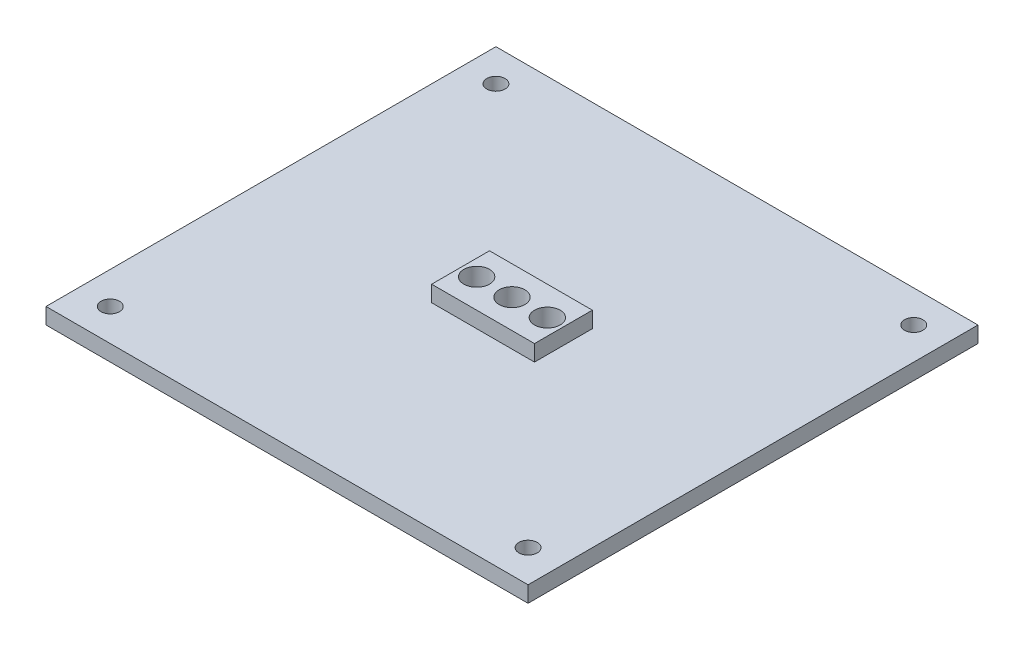
ISO-10303-21;
HEADER;
FILE_DESCRIPTION(('STEP AP214'),'2;1');
FILE_NAME('part.step','',(''),(''),'','','');
FILE_SCHEMA(('AUTOMOTIVE_DESIGN { 1 0 10303 214 1 1 1 1 }'));
ENDSEC;
DATA;
#1=APPLICATION_CONTEXT('core data for automotive mechanical design processes');
#2=APPLICATION_PROTOCOL_DEFINITION('international standard','automotive_design',2000,#1);
#3=PRODUCT_CONTEXT('',#1,'mechanical');
#4=PRODUCT('Part','Part','',(#3));
#5=PRODUCT_RELATED_PRODUCT_CATEGORY('part','',(#4));
#6=PRODUCT_DEFINITION_FORMATION('','',#4);
#7=PRODUCT_DEFINITION_CONTEXT('part definition',#1,'design');
#8=PRODUCT_DEFINITION('design','',#6,#7);
#9=PRODUCT_DEFINITION_SHAPE('','',#8);
#10=(LENGTH_UNIT() NAMED_UNIT(*) SI_UNIT(.MILLI.,.METRE.));
#11=(NAMED_UNIT(*) PLANE_ANGLE_UNIT() SI_UNIT($,.RADIAN.));
#12=(NAMED_UNIT(*) SI_UNIT($,.STERADIAN.) SOLID_ANGLE_UNIT());
#13=UNCERTAINTY_MEASURE_WITH_UNIT(LENGTH_MEASURE(1.E-05),#10,'distance_accuracy_value','');
#14=(GEOMETRIC_REPRESENTATION_CONTEXT(3) GLOBAL_UNCERTAINTY_ASSIGNED_CONTEXT((#13)) GLOBAL_UNIT_ASSIGNED_CONTEXT((#10,
#11,#12)) REPRESENTATION_CONTEXT('',''));
#15=CARTESIAN_POINT('',(0.,0.,0.));
#16=DIRECTION('',(0.,0.,1.));
#17=DIRECTION('',(1.,0.,0.));
#18=AXIS2_PLACEMENT_3D('',#15,#16,#17);
#19=CARTESIAN_POINT('',(0.,5.,0.));
#20=DIRECTION('',(0.,-1.,0.));
#21=DIRECTION('',(0.,0.,-1.));
#22=AXIS2_PLACEMENT_3D('',#19,#20,#21);
#23=PLANE('',#22);
#24=CARTESIAN_POINT('',(-65.5459975016604,5.,11.5427570870634));
#25=DIRECTION('',(0.,1.,0.));
#26=DIRECTION('',(0.,0.,1.));
#27=AXIS2_PLACEMENT_3D('',#24,#25,#26);
#28=CIRCLE('',#27,2.85);
#29=CARTESIAN_POINT('',(-65.5459975016604,5.,14.3927570870634));
#30=VERTEX_POINT('',#29);
#31=EDGE_CURVE('E248',#30,#30,#28,.T.);
#32=ORIENTED_EDGE('',*,*,#31,.F.);
#33=EDGE_LOOP('',(#32));
#34=FACE_BOUND('',#33,.T.);
#35=CARTESIAN_POINT('',(64.4540024983396,5.,11.5427570870634));
#36=DIRECTION('',(0.,1.,0.));
#37=DIRECTION('',(0.,0.,1.));
#38=AXIS2_PLACEMENT_3D('',#35,#36,#37);
#39=CIRCLE('',#38,2.85);
#40=CARTESIAN_POINT('',(64.4540024983396,5.,14.3927570870634));
#41=VERTEX_POINT('',#40);
#42=EDGE_CURVE('E254',#41,#41,#39,.T.);
#43=ORIENTED_EDGE('',*,*,#42,.F.);
#44=EDGE_LOOP('',(#43));
#45=FACE_BOUND('',#44,.T.);
#46=CARTESIAN_POINT('',(64.4540024983396,5.,-108.457242912937));
#47=DIRECTION('',(0.,1.,0.));
#48=DIRECTION('',(0.,0.,1.));
#49=AXIS2_PLACEMENT_3D('',#46,#47,#48);
#50=CIRCLE('',#49,2.85);
#51=CARTESIAN_POINT('',(64.4540024983396,5.,-105.607242912937));
#52=VERTEX_POINT('',#51);
#53=EDGE_CURVE('E260',#52,#52,#50,.T.);
#54=ORIENTED_EDGE('',*,*,#53,.F.);
#55=EDGE_LOOP('',(#54));
#56=FACE_BOUND('',#55,.T.);
#57=CARTESIAN_POINT('',(-65.5459975016604,5.,-108.457242912937));
#58=DIRECTION('',(0.,1.,0.));
#59=DIRECTION('',(0.,0.,1.));
#60=AXIS2_PLACEMENT_3D('',#57,#58,#59);
#61=CIRCLE('',#60,2.85);
#62=CARTESIAN_POINT('',(-65.5459975016604,5.,-105.607242912937));
#63=VERTEX_POINT('',#62);
#64=EDGE_CURVE('E269',#63,#63,#61,.T.);
#65=ORIENTED_EDGE('',*,*,#64,.F.);
#66=EDGE_LOOP('',(#65));
#67=FACE_BOUND('',#66,.T.);
#68=DIRECTION('',(-1.,0.,0.));
#69=VECTOR('',#68,1.);
#70=CARTESIAN_POINT('',(-75.5459975016604,5.,-118.457242912937));
#71=LINE('',#70,#69);
#72=CARTESIAN_POINT('',(74.4540024983396,5.,-118.457242912937));
#73=VERTEX_POINT('',#72);
#74=CARTESIAN_POINT('',(-75.5459975016604,5.,-118.457242912937));
#75=VERTEX_POINT('',#74);
#76=EDGE_CURVE('E275',#73,#75,#71,.T.);
#77=ORIENTED_EDGE('',*,*,#76,.T.);
#78=DIRECTION('',(0.,0.,1.));
#79=VECTOR('',#78,1.);
#80=CARTESIAN_POINT('',(-75.5459975016604,5.,-118.457242912937));
#81=LINE('',#80,#79);
#82=CARTESIAN_POINT('',(-75.5459975016604,5.,21.5427570870634));
#83=VERTEX_POINT('',#82);
#84=EDGE_CURVE('E278',#75,#83,#81,.T.);
#85=ORIENTED_EDGE('',*,*,#84,.T.);
#86=DIRECTION('',(1.,0.,0.));
#87=VECTOR('',#86,1.);
#88=CARTESIAN_POINT('',(-75.5459975016604,5.,21.5427570870634));
#89=LINE('',#88,#87);
#90=CARTESIAN_POINT('',(74.4540024983396,5.,21.5427570870634));
#91=VERTEX_POINT('',#90);
#92=EDGE_CURVE('E281',#83,#91,#89,.T.);
#93=ORIENTED_EDGE('',*,*,#92,.T.);
#94=DIRECTION('',(0.,0.,-1.));
#95=VECTOR('',#94,1.);
#96=CARTESIAN_POINT('',(74.4540024983396,5.,-118.457242912937));
#97=LINE('',#96,#95);
#98=EDGE_CURVE('E283',#91,#73,#97,.T.);
#99=ORIENTED_EDGE('',*,*,#98,.T.);
#100=EDGE_LOOP('',(#77,#85,#93,#99));
#101=FACE_BOUND('',#100,.T.);
#102=DIRECTION('',(0.,0.,-1.));
#103=VECTOR('',#102,1.);
#104=CARTESIAN_POINT('',(15.4540024983396,5.,0.));
#105=LINE('',#104,#103);
#106=CARTESIAN_POINT('',(15.4540024983396,5.,-39.4572429129366));
#107=VERTEX_POINT('',#106);
#108=CARTESIAN_POINT('',(15.4540024983396,5.,-57.4572429129366));
#109=VERTEX_POINT('',#108);
#110=EDGE_CURVE('E165',#107,#109,#105,.T.);
#111=ORIENTED_EDGE('',*,*,#110,.F.);
#112=DIRECTION('',(1.,0.,0.));
#113=VECTOR('',#112,1.);
#114=CARTESIAN_POINT('',(0.,5.,-39.4572429129366));
#115=LINE('',#114,#113);
#116=CARTESIAN_POINT('',(-16.5459975016604,5.,-39.4572429129366));
#117=VERTEX_POINT('',#116);
#118=EDGE_CURVE('E169',#117,#107,#115,.T.);
#119=ORIENTED_EDGE('',*,*,#118,.F.);
#120=DIRECTION('',(0.,0.,1.));
#121=VECTOR('',#120,1.);
#122=CARTESIAN_POINT('',(-16.5459975016604,5.,0.));
#123=LINE('',#122,#121);
#124=CARTESIAN_POINT('',(-16.5459975016604,5.,-57.4572429129367));
#125=VERTEX_POINT('',#124);
#126=EDGE_CURVE('E382',#125,#117,#123,.T.);
#127=ORIENTED_EDGE('',*,*,#126,.F.);
#128=DIRECTION('',(-1.,0.,0.));
#129=VECTOR('',#128,1.);
#130=CARTESIAN_POINT('',(1.24590535182466E-13,5.,-57.4572429129366));
#131=LINE('',#130,#129);
#132=EDGE_CURVE('E380',#109,#125,#131,.T.);
#133=ORIENTED_EDGE('',*,*,#132,.F.);
#134=EDGE_LOOP('',(#111,#119,#127,#133));
#135=FACE_BOUND('',#134,.T.);
#136=ADVANCED_FACE('F150',(#34,#45,#56,#67,#101,#135),#23,.F.);
#137=CARTESIAN_POINT('',(0.,0.,0.));
#138=DIRECTION('',(0.,-1.,0.));
#139=DIRECTION('',(0.,0.,-1.));
#140=AXIS2_PLACEMENT_3D('',#137,#138,#139);
#141=PLANE('',#140);
#142=CARTESIAN_POINT('',(10.4540024983396,0.,-48.4572429129366));
#143=DIRECTION('',(0.,1.,0.));
#144=DIRECTION('',(0.,0.,1.));
#145=AXIS2_PLACEMENT_3D('',#142,#143,#144);
#146=CIRCLE('',#145,4.);
#147=CARTESIAN_POINT('',(10.4540024983396,0.,-44.4572429129366));
#148=VERTEX_POINT('',#147);
#149=EDGE_CURVE('E239',#148,#148,#146,.T.);
#150=ORIENTED_EDGE('',*,*,#149,.T.);
#151=EDGE_LOOP('',(#150));
#152=FACE_BOUND('',#151,.T.);
#153=CARTESIAN_POINT('',(64.4540024983396,0.,11.5427570870634));
#154=DIRECTION('',(0.,1.,0.));
#155=DIRECTION('',(0.,0.,1.));
#156=AXIS2_PLACEMENT_3D('',#153,#154,#155);
#157=CIRCLE('',#156,2.85);
#158=CARTESIAN_POINT('',(64.4540024983396,0.,14.3927570870634));
#159=VERTEX_POINT('',#158);
#160=EDGE_CURVE('E251',#159,#159,#157,.T.);
#161=ORIENTED_EDGE('',*,*,#160,.T.);
#162=EDGE_LOOP('',(#161));
#163=FACE_BOUND('',#162,.T.);
#164=CARTESIAN_POINT('',(-0.545997501660393,0.,-48.4572429129366));
#165=DIRECTION('',(0.,1.,0.));
#166=DIRECTION('',(0.,0.,1.));
#167=AXIS2_PLACEMENT_3D('',#164,#165,#166);
#168=CIRCLE('',#167,4.);
#169=CARTESIAN_POINT('',(-0.545997501660393,0.,-44.4572429129366));
#170=VERTEX_POINT('',#169);
#171=EDGE_CURVE('E263',#170,#170,#168,.T.);
#172=ORIENTED_EDGE('',*,*,#171,.T.);
#173=EDGE_LOOP('',(#172));
#174=FACE_BOUND('',#173,.T.);
#175=DIRECTION('',(-1.,0.,0.));
#176=VECTOR('',#175,1.);
#177=CARTESIAN_POINT('',(-75.5459975016604,0.,-118.457242912937));
#178=LINE('',#177,#176);
#179=CARTESIAN_POINT('',(74.4540024983396,0.,-118.457242912937));
#180=VERTEX_POINT('',#179);
#181=CARTESIAN_POINT('',(-75.5459975016604,0.,-118.457242912937));
#182=VERTEX_POINT('',#181);
#183=EDGE_CURVE('E272',#180,#182,#178,.T.);
#184=ORIENTED_EDGE('',*,*,#183,.F.);
#185=DIRECTION('',(0.,0.,-1.));
#186=VECTOR('',#185,1.);
#187=CARTESIAN_POINT('',(74.4540024983396,0.,-118.457242912937));
#188=LINE('',#187,#186);
#189=CARTESIAN_POINT('',(74.4540024983396,0.,21.5427570870634));
#190=VERTEX_POINT('',#189);
#191=EDGE_CURVE('E279',#190,#180,#188,.T.);
#192=ORIENTED_EDGE('',*,*,#191,.F.);
#193=DIRECTION('',(1.,0.,0.));
#194=VECTOR('',#193,1.);
#195=CARTESIAN_POINT('',(-75.5459975016604,0.,21.5427570870634));
#196=LINE('',#195,#194);
#197=CARTESIAN_POINT('',(-75.5459975016604,0.,21.5427570870634));
#198=VERTEX_POINT('',#197);
#199=EDGE_CURVE('E290',#198,#190,#196,.T.);
#200=ORIENTED_EDGE('',*,*,#199,.F.);
#201=DIRECTION('',(0.,0.,1.));
#202=VECTOR('',#201,1.);
#203=CARTESIAN_POINT('',(-75.5459975016604,0.,-118.457242912937));
#204=LINE('',#203,#202);
#205=EDGE_CURVE('E288',#182,#198,#204,.T.);
#206=ORIENTED_EDGE('',*,*,#205,.F.);
#207=EDGE_LOOP('',(#184,#192,#200,#206));
#208=FACE_BOUND('',#207,.T.);
#209=CARTESIAN_POINT('',(-65.5459975016604,0.,-108.457242912937));
#210=DIRECTION('',(0.,1.,0.));
#211=DIRECTION('',(0.,0.,1.));
#212=AXIS2_PLACEMENT_3D('',#209,#210,#211);
#213=CIRCLE('',#212,2.85);
#214=CARTESIAN_POINT('',(-65.5459975016604,0.,-105.607242912937));
#215=VERTEX_POINT('',#214);
#216=EDGE_CURVE('E268',#215,#215,#213,.T.);
#217=ORIENTED_EDGE('',*,*,#216,.T.);
#218=EDGE_LOOP('',(#217));
#219=FACE_BOUND('',#218,.T.);
#220=CARTESIAN_POINT('',(64.4540024983396,0.,-108.457242912937));
#221=DIRECTION('',(0.,1.,0.));
#222=DIRECTION('',(0.,0.,1.));
#223=AXIS2_PLACEMENT_3D('',#220,#221,#222);
#224=CIRCLE('',#223,2.85);
#225=CARTESIAN_POINT('',(64.4540024983396,0.,-105.607242912937));
#226=VERTEX_POINT('',#225);
#227=EDGE_CURVE('E257',#226,#226,#224,.T.);
#228=ORIENTED_EDGE('',*,*,#227,.T.);
#229=EDGE_LOOP('',(#228));
#230=FACE_BOUND('',#229,.T.);
#231=CARTESIAN_POINT('',(-65.5459975016604,0.,11.5427570870634));
#232=DIRECTION('',(0.,1.,0.));
#233=DIRECTION('',(0.,0.,1.));
#234=AXIS2_PLACEMENT_3D('',#231,#232,#233);
#235=CIRCLE('',#234,2.85);
#236=CARTESIAN_POINT('',(-65.5459975016604,0.,14.3927570870634));
#237=VERTEX_POINT('',#236);
#238=EDGE_CURVE('E247',#237,#237,#235,.T.);
#239=ORIENTED_EDGE('',*,*,#238,.T.);
#240=EDGE_LOOP('',(#239));
#241=FACE_BOUND('',#240,.T.);
#242=CARTESIAN_POINT('',(-11.5459975016604,0.,-48.4572429129366));
#243=DIRECTION('',(0.,1.,0.));
#244=DIRECTION('',(0.,0.,1.));
#245=AXIS2_PLACEMENT_3D('',#242,#243,#244);
#246=CIRCLE('',#245,4.);
#247=CARTESIAN_POINT('',(-11.5459975016604,0.,-44.4572429129366));
#248=VERTEX_POINT('',#247);
#249=EDGE_CURVE('E236',#248,#248,#246,.T.);
#250=ORIENTED_EDGE('',*,*,#249,.T.);
#251=EDGE_LOOP('',(#250));
#252=FACE_BOUND('',#251,.T.);
#253=ADVANCED_FACE('F308',(#152,#163,#174,#208,#219,#230,#241,#252),#141,.T.);
#254=CARTESIAN_POINT('',(-75.5459975016604,5.,-118.457242912937));
#255=DIRECTION('',(0.,0.,1.));
#256=DIRECTION('',(1.,0.,0.));
#257=AXIS2_PLACEMENT_3D('',#254,#255,#256);
#258=PLANE('',#257);
#259=ORIENTED_EDGE('',*,*,#183,.T.);
#260=DIRECTION('',(0.,-1.,0.));
#261=VECTOR('',#260,1.);
#262=CARTESIAN_POINT('',(-75.5459975016604,5.,-118.457242912937));
#263=LINE('',#262,#261);
#264=EDGE_CURVE('E12',#75,#182,#263,.T.);
#265=ORIENTED_EDGE('',*,*,#264,.F.);
#266=ORIENTED_EDGE('',*,*,#76,.F.);
#267=DIRECTION('',(0.,-1.,0.));
#268=VECTOR('',#267,1.);
#269=CARTESIAN_POINT('',(74.4540024983396,5.,-118.457242912937));
#270=LINE('',#269,#268);
#271=EDGE_CURVE('E285',#73,#180,#270,.T.);
#272=ORIENTED_EDGE('',*,*,#271,.T.);
#273=EDGE_LOOP('',(#259,#265,#266,#272));
#274=FACE_BOUND('',#273,.T.);
#275=ADVANCED_FACE('F152',(#274),#258,.F.);
#276=CARTESIAN_POINT('',(-75.5459975016604,5.,-118.457242912937));
#277=DIRECTION('',(1.,0.,0.));
#278=DIRECTION('',(0.,0.,-1.));
#279=AXIS2_PLACEMENT_3D('',#276,#277,#278);
#280=PLANE('',#279);
#281=ORIENTED_EDGE('',*,*,#205,.T.);
#282=DIRECTION('',(0.,-1.,0.));
#283=VECTOR('',#282,1.);
#284=CARTESIAN_POINT('',(-75.5459975016604,5.,21.5427570870634));
#285=LINE('',#284,#283);
#286=EDGE_CURVE('E158',#83,#198,#285,.T.);
#287=ORIENTED_EDGE('',*,*,#286,.F.);
#288=ORIENTED_EDGE('',*,*,#84,.F.);
#289=ORIENTED_EDGE('',*,*,#264,.T.);
#290=EDGE_LOOP('',(#281,#287,#288,#289));
#291=FACE_BOUND('',#290,.T.);
#292=ADVANCED_FACE('F318',(#291),#280,.F.);
#293=CARTESIAN_POINT('',(-75.5459975016604,5.,21.5427570870634));
#294=DIRECTION('',(0.,0.,-1.));
#295=DIRECTION('',(-1.,0.,0.));
#296=AXIS2_PLACEMENT_3D('',#293,#294,#295);
#297=PLANE('',#296);
#298=ORIENTED_EDGE('',*,*,#199,.T.);
#299=DIRECTION('',(0.,-1.,0.));
#300=VECTOR('',#299,1.);
#301=CARTESIAN_POINT('',(74.4540024983396,5.,21.5427570870634));
#302=LINE('',#301,#300);
#303=EDGE_CURVE('E295',#91,#190,#302,.T.);
#304=ORIENTED_EDGE('',*,*,#303,.F.);
#305=ORIENTED_EDGE('',*,*,#92,.F.);
#306=ORIENTED_EDGE('',*,*,#286,.T.);
#307=EDGE_LOOP('',(#298,#304,#305,#306));
#308=FACE_BOUND('',#307,.T.);
#309=ADVANCED_FACE('F302',(#308),#297,.F.);
#310=CARTESIAN_POINT('',(74.4540024983396,5.,-118.457242912937));
#311=DIRECTION('',(-1.,0.,0.));
#312=DIRECTION('',(0.,0.,1.));
#313=AXIS2_PLACEMENT_3D('',#310,#311,#312);
#314=PLANE('',#313);
#315=ORIENTED_EDGE('',*,*,#191,.T.);
#316=ORIENTED_EDGE('',*,*,#271,.F.);
#317=ORIENTED_EDGE('',*,*,#98,.F.);
#318=ORIENTED_EDGE('',*,*,#303,.T.);
#319=EDGE_LOOP('',(#315,#316,#317,#318));
#320=FACE_BOUND('',#319,.T.);
#321=ADVANCED_FACE('F312',(#320),#314,.F.);
#322=CARTESIAN_POINT('',(-65.5459975016604,5.,-108.457242912937));
#323=DIRECTION('',(0.,-1.,0.));
#324=DIRECTION('',(0.,0.,-1.));
#325=AXIS2_PLACEMENT_3D('',#322,#323,#324);
#326=CYLINDRICAL_SURFACE('',#325,2.85);
#327=ORIENTED_EDGE('',*,*,#64,.T.);
#328=EDGE_LOOP('',(#327));
#329=FACE_BOUND('',#328,.T.);
#330=ORIENTED_EDGE('',*,*,#216,.F.);
#331=EDGE_LOOP('',(#330));
#332=FACE_BOUND('',#331,.T.);
#333=ADVANCED_FACE('F336',(#329,#332),#326,.F.);
#334=CARTESIAN_POINT('',(-0.545997501660393,5.,-48.4572429129366));
#335=DIRECTION('',(0.,-1.,0.));
#336=DIRECTION('',(0.,0.,-1.));
#337=AXIS2_PLACEMENT_3D('',#334,#335,#336);
#338=CYLINDRICAL_SURFACE('',#337,4.);
#339=ORIENTED_EDGE('',*,*,#171,.F.);
#340=EDGE_LOOP('',(#339));
#341=FACE_BOUND('',#340,.T.);
#342=CARTESIAN_POINT('',(-0.545997501660393,10.,-48.4572429129366));
#343=DIRECTION('',(0.,1.,0.));
#344=DIRECTION('',(0.,0.,1.));
#345=AXIS2_PLACEMENT_3D('',#342,#343,#344);
#346=CIRCLE('',#345,4.);
#347=CARTESIAN_POINT('',(-0.545997501660393,10.,-44.4572429129366));
#348=VERTEX_POINT('',#347);
#349=EDGE_CURVE('E369',#348,#348,#346,.F.);
#350=ORIENTED_EDGE('',*,*,#349,.F.);
#351=EDGE_LOOP('',(#350));
#352=FACE_BOUND('',#351,.T.);
#353=ADVANCED_FACE('F343',(#341,#352),#338,.F.);
#354=CARTESIAN_POINT('',(64.4540024983396,5.,-108.457242912937));
#355=DIRECTION('',(0.,-1.,0.));
#356=DIRECTION('',(0.,0.,-1.));
#357=AXIS2_PLACEMENT_3D('',#354,#355,#356);
#358=CYLINDRICAL_SURFACE('',#357,2.85);
#359=ORIENTED_EDGE('',*,*,#53,.T.);
#360=EDGE_LOOP('',(#359));
#361=FACE_BOUND('',#360,.T.);
#362=ORIENTED_EDGE('',*,*,#227,.F.);
#363=EDGE_LOOP('',(#362));
#364=FACE_BOUND('',#363,.T.);
#365=ADVANCED_FACE('F348',(#361,#364),#358,.F.);
#366=CARTESIAN_POINT('',(64.4540024983396,5.,11.5427570870634));
#367=DIRECTION('',(0.,-1.,0.));
#368=DIRECTION('',(0.,0.,-1.));
#369=AXIS2_PLACEMENT_3D('',#366,#367,#368);
#370=CYLINDRICAL_SURFACE('',#369,2.85);
#371=ORIENTED_EDGE('',*,*,#42,.T.);
#372=EDGE_LOOP('',(#371));
#373=FACE_BOUND('',#372,.T.);
#374=ORIENTED_EDGE('',*,*,#160,.F.);
#375=EDGE_LOOP('',(#374));
#376=FACE_BOUND('',#375,.T.);
#377=ADVANCED_FACE('F409',(#373,#376),#370,.F.);
#378=CARTESIAN_POINT('',(-65.5459975016604,5.,11.5427570870634));
#379=DIRECTION('',(0.,-1.,0.));
#380=DIRECTION('',(0.,0.,-1.));
#381=AXIS2_PLACEMENT_3D('',#378,#379,#380);
#382=CYLINDRICAL_SURFACE('',#381,2.85);
#383=ORIENTED_EDGE('',*,*,#31,.T.);
#384=EDGE_LOOP('',(#383));
#385=FACE_BOUND('',#384,.T.);
#386=ORIENTED_EDGE('',*,*,#238,.F.);
#387=EDGE_LOOP('',(#386));
#388=FACE_BOUND('',#387,.T.);
#389=ADVANCED_FACE('F405',(#385,#388),#382,.F.);
#390=CARTESIAN_POINT('',(10.4540024983396,5.,-48.4572429129366));
#391=DIRECTION('',(0.,-1.,0.));
#392=DIRECTION('',(0.,0.,-1.));
#393=AXIS2_PLACEMENT_3D('',#390,#391,#392);
#394=CYLINDRICAL_SURFACE('',#393,4.);
#395=ORIENTED_EDGE('',*,*,#149,.F.);
#396=EDGE_LOOP('',(#395));
#397=FACE_BOUND('',#396,.T.);
#398=CARTESIAN_POINT('',(10.4540024983396,10.,-48.4572429129366));
#399=DIRECTION('',(0.,1.,0.));
#400=DIRECTION('',(0.,0.,1.));
#401=AXIS2_PLACEMENT_3D('',#398,#399,#400);
#402=CIRCLE('',#401,4.);
#403=CARTESIAN_POINT('',(10.4540024983396,10.,-44.4572429129366));
#404=VERTEX_POINT('',#403);
#405=EDGE_CURVE('E233',#404,#404,#402,.F.);
#406=ORIENTED_EDGE('',*,*,#405,.F.);
#407=EDGE_LOOP('',(#406));
#408=FACE_BOUND('',#407,.T.);
#409=ADVANCED_FACE('F363',(#397,#408),#394,.F.);
#410=CARTESIAN_POINT('',(-11.5459975016604,5.,-48.4572429129366));
#411=DIRECTION('',(0.,-1.,0.));
#412=DIRECTION('',(0.,0.,-1.));
#413=AXIS2_PLACEMENT_3D('',#410,#411,#412);
#414=CYLINDRICAL_SURFACE('',#413,4.);
#415=ORIENTED_EDGE('',*,*,#249,.F.);
#416=EDGE_LOOP('',(#415));
#417=FACE_BOUND('',#416,.T.);
#418=CARTESIAN_POINT('',(-11.5459975016604,10.,-48.4572429129366));
#419=DIRECTION('',(0.,1.,0.));
#420=DIRECTION('',(0.,0.,1.));
#421=AXIS2_PLACEMENT_3D('',#418,#419,#420);
#422=CIRCLE('',#421,4.);
#423=CARTESIAN_POINT('',(-11.5459975016604,10.,-44.4572429129366));
#424=VERTEX_POINT('',#423);
#425=EDGE_CURVE('E367',#424,#424,#422,.F.);
#426=ORIENTED_EDGE('',*,*,#425,.F.);
#427=EDGE_LOOP('',(#426));
#428=FACE_BOUND('',#427,.T.);
#429=ADVANCED_FACE('F360',(#417,#428),#414,.F.);
#430=CARTESIAN_POINT('',(15.4540024983396,10.,0.));
#431=DIRECTION('',(-1.,0.,0.));
#432=DIRECTION('',(0.,0.,1.));
#433=AXIS2_PLACEMENT_3D('',#430,#431,#432);
#434=PLANE('',#433);
#435=ORIENTED_EDGE('',*,*,#110,.T.);
#436=DIRECTION('',(0.,-1.,0.));
#437=VECTOR('',#436,1.);
#438=CARTESIAN_POINT('',(15.4540024983396,10.,-57.4572429129366));
#439=LINE('',#438,#437);
#440=CARTESIAN_POINT('',(15.4540024983396,10.,-57.4572429129366));
#441=VERTEX_POINT('',#440);
#442=EDGE_CURVE('E218',#441,#109,#439,.T.);
#443=ORIENTED_EDGE('',*,*,#442,.F.);
#444=DIRECTION('',(0.,0.,-1.));
#445=VECTOR('',#444,1.);
#446=CARTESIAN_POINT('',(15.4540024983396,10.,0.));
#447=LINE('',#446,#445);
#448=CARTESIAN_POINT('',(15.4540024983396,10.,-39.4572429129366));
#449=VERTEX_POINT('',#448);
#450=EDGE_CURVE('E224',#449,#441,#447,.T.);
#451=ORIENTED_EDGE('',*,*,#450,.F.);
#452=DIRECTION('',(0.,-1.,0.));
#453=VECTOR('',#452,1.);
#454=CARTESIAN_POINT('',(15.4540024983396,10.,-39.4572429129366));
#455=LINE('',#454,#453);
#456=EDGE_CURVE('E378',#449,#107,#455,.T.);
#457=ORIENTED_EDGE('',*,*,#456,.T.);
#458=EDGE_LOOP('',(#435,#443,#451,#457));
#459=FACE_BOUND('',#458,.T.);
#460=ADVANCED_FACE('F235',(#459),#434,.F.);
#461=CARTESIAN_POINT('',(0.,10.,-39.4572429129366));
#462=DIRECTION('',(0.,0.,-1.));
#463=DIRECTION('',(-1.,0.,0.));
#464=AXIS2_PLACEMENT_3D('',#461,#462,#463);
#465=PLANE('',#464);
#466=ORIENTED_EDGE('',*,*,#118,.T.);
#467=ORIENTED_EDGE('',*,*,#456,.F.);
#468=DIRECTION('',(1.,0.,0.));
#469=VECTOR('',#468,1.);
#470=CARTESIAN_POINT('',(0.,10.,-39.4572429129366));
#471=LINE('',#470,#469);
#472=CARTESIAN_POINT('',(-16.5459975016604,10.,-39.4572429129366));
#473=VERTEX_POINT('',#472);
#474=EDGE_CURVE('E229',#473,#449,#471,.T.);
#475=ORIENTED_EDGE('',*,*,#474,.F.);
#476=DIRECTION('',(0.,-1.,0.));
#477=VECTOR('',#476,1.);
#478=CARTESIAN_POINT('',(-16.5459975016604,10.,-39.4572429129366));
#479=LINE('',#478,#477);
#480=EDGE_CURVE('E241',#473,#117,#479,.T.);
#481=ORIENTED_EDGE('',*,*,#480,.T.);
#482=EDGE_LOOP('',(#466,#467,#475,#481));
#483=FACE_BOUND('',#482,.T.);
#484=ADVANCED_FACE('F388',(#483),#465,.F.);
#485=CARTESIAN_POINT('',(-16.5459975016604,10.,0.));
#486=DIRECTION('',(1.,0.,0.));
#487=DIRECTION('',(0.,0.,-1.));
#488=AXIS2_PLACEMENT_3D('',#485,#486,#487);
#489=PLANE('',#488);
#490=ORIENTED_EDGE('',*,*,#126,.T.);
#491=ORIENTED_EDGE('',*,*,#480,.F.);
#492=DIRECTION('',(0.,0.,1.));
#493=VECTOR('',#492,1.);
#494=CARTESIAN_POINT('',(-16.5459975016604,10.,0.));
#495=LINE('',#494,#493);
#496=CARTESIAN_POINT('',(-16.5459975016604,10.,-57.4572429129367));
#497=VERTEX_POINT('',#496);
#498=EDGE_CURVE('E223',#497,#473,#495,.T.);
#499=ORIENTED_EDGE('',*,*,#498,.F.);
#500=DIRECTION('',(0.,-1.,0.));
#501=VECTOR('',#500,1.);
#502=CARTESIAN_POINT('',(-16.5459975016604,10.,-57.4572429129367));
#503=LINE('',#502,#501);
#504=EDGE_CURVE('E220',#497,#125,#503,.T.);
#505=ORIENTED_EDGE('',*,*,#504,.T.);
#506=EDGE_LOOP('',(#490,#491,#499,#505));
#507=FACE_BOUND('',#506,.T.);
#508=ADVANCED_FACE('F390',(#507),#489,.F.);
#509=CARTESIAN_POINT('',(1.24590535182466E-13,10.,-57.4572429129366));
#510=DIRECTION('',(0.,0.,1.));
#511=DIRECTION('',(1.,0.,0.));
#512=AXIS2_PLACEMENT_3D('',#509,#510,#511);
#513=PLANE('',#512);
#514=ORIENTED_EDGE('',*,*,#132,.T.);
#515=ORIENTED_EDGE('',*,*,#504,.F.);
#516=DIRECTION('',(-1.,0.,0.));
#517=VECTOR('',#516,1.);
#518=CARTESIAN_POINT('',(1.24590535182466E-13,10.,-57.4572429129366));
#519=LINE('',#518,#517);
#520=EDGE_CURVE('E213',#441,#497,#519,.T.);
#521=ORIENTED_EDGE('',*,*,#520,.F.);
#522=ORIENTED_EDGE('',*,*,#442,.T.);
#523=EDGE_LOOP('',(#514,#515,#521,#522));
#524=FACE_BOUND('',#523,.T.);
#525=ADVANCED_FACE('F216',(#524),#513,.F.);
#526=CARTESIAN_POINT('',(0.,10.,0.));
#527=DIRECTION('',(0.,1.,0.));
#528=DIRECTION('',(0.,0.,1.));
#529=AXIS2_PLACEMENT_3D('',#526,#527,#528);
#530=PLANE('',#529);
#531=ORIENTED_EDGE('',*,*,#349,.T.);
#532=EDGE_LOOP('',(#531));
#533=FACE_BOUND('',#532,.T.);
#534=ORIENTED_EDGE('',*,*,#425,.T.);
#535=EDGE_LOOP('',(#534));
#536=FACE_BOUND('',#535,.T.);
#537=ORIENTED_EDGE('',*,*,#405,.T.);
#538=EDGE_LOOP('',(#537));
#539=FACE_BOUND('',#538,.T.);
#540=ORIENTED_EDGE('',*,*,#450,.T.);
#541=ORIENTED_EDGE('',*,*,#520,.T.);
#542=ORIENTED_EDGE('',*,*,#498,.T.);
#543=ORIENTED_EDGE('',*,*,#474,.T.);
#544=EDGE_LOOP('',(#540,#541,#542,#543));
#545=FACE_BOUND('',#544,.T.);
#546=ADVANCED_FACE('F227',(#533,#536,#539,#545),#530,.T.);
#547=CLOSED_SHELL('',(#136,#253,#275,#292,#309,#321,#333,#353,#365,#377,#389,#409,#429,#460,
#484,#508,#525,#546));
#548=MANIFOLD_SOLID_BREP('B2',#547);
#549=ADVANCED_BREP_SHAPE_REPRESENTATION('',(#18,#548),#14);
#550=SHAPE_DEFINITION_REPRESENTATION(#9,#549);
ENDSEC;
END-ISO-10303-21;
